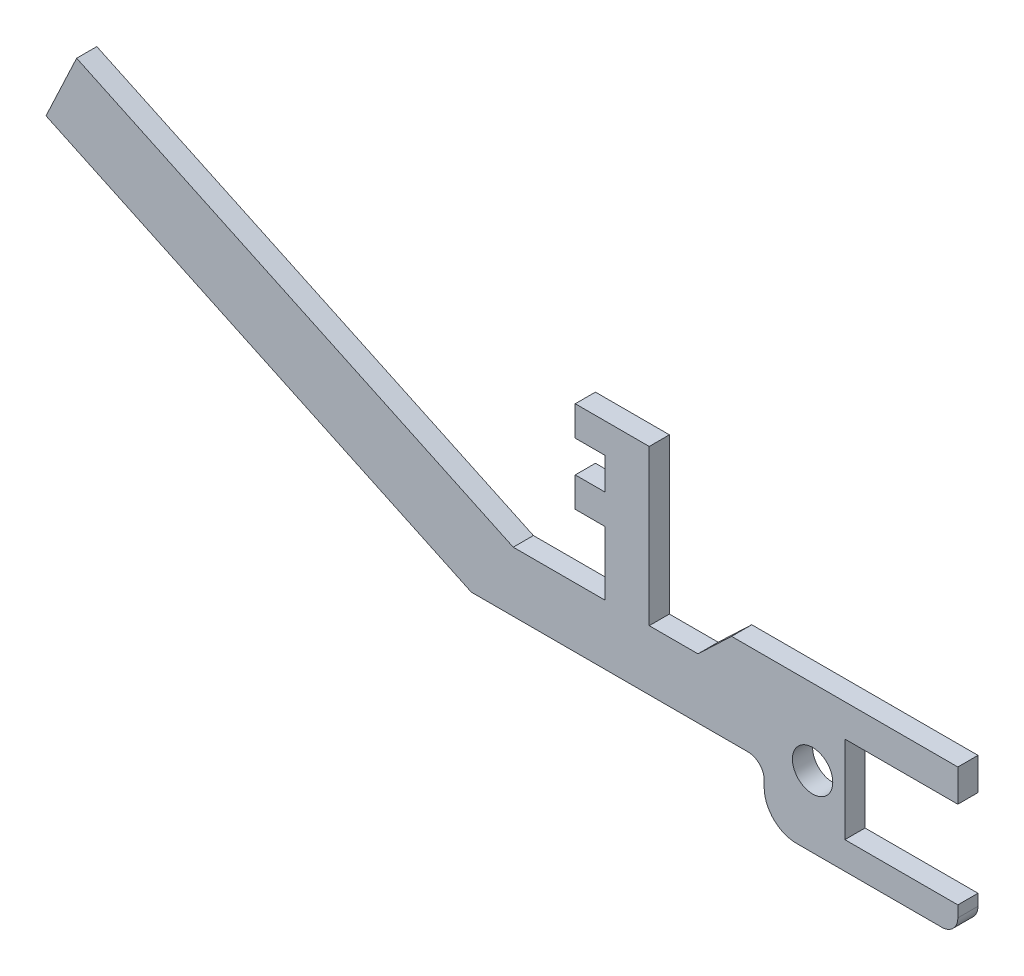
ISO-10303-21;
HEADER;
FILE_DESCRIPTION(('STEP AP214'),'2;1');
FILE_NAME('part.step','',(''),(''),'','','');
FILE_SCHEMA(('AUTOMOTIVE_DESIGN { 1 0 10303 214 1 1 1 1 }'));
ENDSEC;
DATA;
#1=APPLICATION_CONTEXT('core data for automotive mechanical design processes');
#2=APPLICATION_PROTOCOL_DEFINITION('international standard','automotive_design',2000,#1);
#3=PRODUCT_CONTEXT('',#1,'mechanical');
#4=PRODUCT('Part','Part','',(#3));
#5=PRODUCT_RELATED_PRODUCT_CATEGORY('part','',(#4));
#6=PRODUCT_DEFINITION_FORMATION('','',#4);
#7=PRODUCT_DEFINITION_CONTEXT('part definition',#1,'design');
#8=PRODUCT_DEFINITION('design','',#6,#7);
#9=PRODUCT_DEFINITION_SHAPE('','',#8);
#10=(LENGTH_UNIT() NAMED_UNIT(*) SI_UNIT(.MILLI.,.METRE.));
#11=(NAMED_UNIT(*) PLANE_ANGLE_UNIT() SI_UNIT($,.RADIAN.));
#12=(NAMED_UNIT(*) SI_UNIT($,.STERADIAN.) SOLID_ANGLE_UNIT());
#13=UNCERTAINTY_MEASURE_WITH_UNIT(LENGTH_MEASURE(1.E-05),#10,'distance_accuracy_value','');
#14=(GEOMETRIC_REPRESENTATION_CONTEXT(3) GLOBAL_UNCERTAINTY_ASSIGNED_CONTEXT((#13)) GLOBAL_UNIT_ASSIGNED_CONTEXT((#10,
#11,#12)) REPRESENTATION_CONTEXT('',''));
#15=CARTESIAN_POINT('',(0.,0.,0.));
#16=DIRECTION('',(0.,0.,1.));
#17=DIRECTION('',(1.,0.,0.));
#18=AXIS2_PLACEMENT_3D('',#15,#16,#17);
#19=CARTESIAN_POINT('',(-5.08,-2.52959583838729,1.5875));
#20=DIRECTION('',(0.,0.,-1.));
#21=DIRECTION('',(-1.,0.,0.));
#22=AXIS2_PLACEMENT_3D('',#19,#20,#21);
#23=PLANE('',#22);
#24=DIRECTION('',(-0.90506567515164,0.425271823264022,0.));
#25=VECTOR('',#24,1.);
#26=CARTESIAN_POINT('',(-23.5589132775391,3.45516403300759,1.5875));
#27=LINE('',#26,#25);
#28=CARTESIAN_POINT('',(-23.5589132775391,3.45516403300759,1.5875));
#29=VERTEX_POINT('',#28);
#30=CARTESIAN_POINT('',(-57.9194778554067,19.6004895575477,1.5875));
#31=VERTEX_POINT('',#30);
#32=EDGE_CURVE('E297',#29,#31,#27,.T.);
#33=ORIENTED_EDGE('',*,*,#32,.T.);
#34=DIRECTION('',(-0.425271823264022,-0.90506567515164,0.));
#35=VECTOR('',#34,1.);
#36=CARTESIAN_POINT('',(-60.3304128804337,14.4695252735159,1.5875));
#37=LINE('',#36,#35);
#38=CARTESIAN_POINT('',(-60.3304128804337,14.4695252735159,1.5875));
#39=VERTEX_POINT('',#38);
#40=EDGE_CURVE('E150',#31,#39,#37,.T.);
#41=ORIENTED_EDGE('',*,*,#40,.T.);
#42=DIRECTION('',(0.90506567515164,-0.425271823264022,0.));
#43=VECTOR('',#42,1.);
#44=CARTESIAN_POINT('',(-26.8556166679215,-1.2595958383873,1.5875));
#45=LINE('',#44,#43);
#46=CARTESIAN_POINT('',(-26.8556166679215,-1.2595958383873,1.5875));
#47=VERTEX_POINT('',#46);
#48=EDGE_CURVE('E369',#39,#47,#45,.T.);
#49=ORIENTED_EDGE('',*,*,#48,.T.);
#50=DIRECTION('',(1.,0.,0.));
#51=VECTOR('',#50,1.);
#52=CARTESIAN_POINT('',(-5.08000000000001,-1.25959583838729,1.5875));
#53=LINE('',#52,#51);
#54=CARTESIAN_POINT('',(-5.08000000000001,-1.25959583838729,1.5875));
#55=VERTEX_POINT('',#54);
#56=EDGE_CURVE('E388',#47,#55,#53,.T.);
#57=ORIENTED_EDGE('',*,*,#56,.T.);
#58=CARTESIAN_POINT('',(-5.08,-2.52959583838729,1.5875));
#59=DIRECTION('',(0.,0.,-1.));
#60=DIRECTION('',(-1.,0.,0.));
#61=AXIS2_PLACEMENT_3D('',#58,#59,#60);
#62=CIRCLE('',#61,1.27);
#63=CARTESIAN_POINT('',(-3.81,-2.5295958383873,1.5875));
#64=VERTEX_POINT('',#63);
#65=EDGE_CURVE('E385',#55,#64,#62,.T.);
#66=ORIENTED_EDGE('',*,*,#65,.T.);
#67=DIRECTION('',(0.,-1.,0.));
#68=VECTOR('',#67,1.);
#69=CARTESIAN_POINT('',(-3.81,-3.048,1.5875));
#70=LINE('',#69,#68);
#71=CARTESIAN_POINT('',(-3.81,-3.048,1.5875));
#72=VERTEX_POINT('',#71);
#73=EDGE_CURVE('E387',#64,#72,#70,.T.);
#74=ORIENTED_EDGE('',*,*,#73,.T.);
#75=CARTESIAN_POINT('',(-1.27,-3.048,1.5875));
#76=DIRECTION('',(0.,0.,1.));
#77=DIRECTION('',(-1.,0.,0.));
#78=AXIS2_PLACEMENT_3D('',#75,#76,#77);
#79=CIRCLE('',#78,2.54);
#80=CARTESIAN_POINT('',(-1.27,-5.588,1.5875));
#81=VERTEX_POINT('',#80);
#82=EDGE_CURVE('E390',#72,#81,#79,.T.);
#83=ORIENTED_EDGE('',*,*,#82,.T.);
#84=DIRECTION('',(1.,0.,0.));
#85=VECTOR('',#84,1.);
#86=CARTESIAN_POINT('',(10.16,-5.588,1.5875));
#87=LINE('',#86,#85);
#88=CARTESIAN_POINT('',(10.16,-5.588,1.5875));
#89=VERTEX_POINT('',#88);
#90=EDGE_CURVE('E396',#81,#89,#87,.T.);
#91=ORIENTED_EDGE('',*,*,#90,.T.);
#92=CARTESIAN_POINT('',(10.16,-4.318,1.5875));
#93=DIRECTION('',(0.,0.,1.));
#94=DIRECTION('',(-1.,0.,0.));
#95=AXIS2_PLACEMENT_3D('',#92,#93,#94);
#96=CIRCLE('',#95,1.27);
#97=CARTESIAN_POINT('',(11.43,-4.318,1.5875));
#98=VERTEX_POINT('',#97);
#99=EDGE_CURVE('E398',#89,#98,#96,.T.);
#100=ORIENTED_EDGE('',*,*,#99,.T.);
#101=DIRECTION('',(0.,1.,0.));
#102=VECTOR('',#101,1.);
#103=CARTESIAN_POINT('',(11.43,-3.429,1.5875));
#104=LINE('',#103,#102);
#105=CARTESIAN_POINT('',(11.43,-3.429,1.5875));
#106=VERTEX_POINT('',#105);
#107=EDGE_CURVE('E400',#98,#106,#104,.T.);
#108=ORIENTED_EDGE('',*,*,#107,.T.);
#109=DIRECTION('',(-1.,0.,0.));
#110=VECTOR('',#109,1.);
#111=CARTESIAN_POINT('',(2.54,-3.429,1.5875));
#112=LINE('',#111,#110);
#113=CARTESIAN_POINT('',(2.54,-3.429,1.5875));
#114=VERTEX_POINT('',#113);
#115=EDGE_CURVE('E402',#106,#114,#112,.T.);
#116=ORIENTED_EDGE('',*,*,#115,.T.);
#117=DIRECTION('',(0.,1.,0.));
#118=VECTOR('',#117,1.);
#119=CARTESIAN_POINT('',(2.54,3.429,1.5875));
#120=LINE('',#119,#118);
#121=CARTESIAN_POINT('',(2.54,3.429,1.5875));
#122=VERTEX_POINT('',#121);
#123=EDGE_CURVE('E404',#114,#122,#120,.T.);
#124=ORIENTED_EDGE('',*,*,#123,.T.);
#125=DIRECTION('',(1.,0.,0.));
#126=VECTOR('',#125,1.);
#127=CARTESIAN_POINT('',(11.43,3.429,1.5875));
#128=LINE('',#127,#126);
#129=CARTESIAN_POINT('',(11.43,3.429,1.5875));
#130=VERTEX_POINT('',#129);
#131=EDGE_CURVE('E406',#122,#130,#128,.T.);
#132=ORIENTED_EDGE('',*,*,#131,.T.);
#133=DIRECTION('',(0.,1.,0.));
#134=VECTOR('',#133,1.);
#135=CARTESIAN_POINT('',(11.43,5.969,1.5875));
#136=LINE('',#135,#134);
#137=CARTESIAN_POINT('',(11.43,5.969,1.5875));
#138=VERTEX_POINT('',#137);
#139=EDGE_CURVE('E408',#130,#138,#136,.T.);
#140=ORIENTED_EDGE('',*,*,#139,.T.);
#141=DIRECTION('',(-1.,0.,0.));
#142=VECTOR('',#141,1.);
#143=CARTESIAN_POINT('',(-6.3743216515683,5.969,1.5875));
#144=LINE('',#143,#142);
#145=CARTESIAN_POINT('',(-6.3743216515683,5.969,1.5875));
#146=VERTEX_POINT('',#145);
#147=EDGE_CURVE('E410',#138,#146,#144,.T.);
#148=ORIENTED_EDGE('',*,*,#147,.T.);
#149=DIRECTION('',(-0.724999433594413,-0.688749461914694,0.));
#150=VECTOR('',#149,1.);
#151=CARTESIAN_POINT('',(-9.0204647747182,3.45516403300759,1.5875));
#152=LINE('',#151,#150);
#153=CARTESIAN_POINT('',(-9.0204647747182,3.45516403300759,1.5875));
#154=VERTEX_POINT('',#153);
#155=EDGE_CURVE('E412',#146,#154,#152,.T.);
#156=ORIENTED_EDGE('',*,*,#155,.T.);
#157=DIRECTION('',(-1.,0.,0.));
#158=VECTOR('',#157,1.);
#159=CARTESIAN_POINT('',(-12.8573723032856,3.45516403300759,1.5875));
#160=LINE('',#159,#158);
#161=CARTESIAN_POINT('',(-12.8573723032856,3.45516403300759,1.5875));
#162=VERTEX_POINT('',#161);
#163=EDGE_CURVE('E414',#154,#162,#160,.T.);
#164=ORIENTED_EDGE('',*,*,#163,.T.);
#165=DIRECTION('',(0.,1.,0.));
#166=VECTOR('',#165,1.);
#167=CARTESIAN_POINT('',(-12.8573723032856,15.6723538511447,1.5875));
#168=LINE('',#167,#166);
#169=CARTESIAN_POINT('',(-12.8573723032856,15.6723538511447,1.5875));
#170=VERTEX_POINT('',#169);
#171=EDGE_CURVE('E416',#162,#170,#168,.T.);
#172=ORIENTED_EDGE('',*,*,#171,.T.);
#173=DIRECTION('',(-1.,0.,0.));
#174=VECTOR('',#173,1.);
#175=CARTESIAN_POINT('',(-18.6788871742153,15.6723538511447,1.5875));
#176=LINE('',#175,#174);
#177=CARTESIAN_POINT('',(-18.6788871742153,15.6723538511447,1.5875));
#178=VERTEX_POINT('',#177);
#179=EDGE_CURVE('E418',#170,#178,#176,.T.);
#180=ORIENTED_EDGE('',*,*,#179,.T.);
#181=DIRECTION('',(0.,-1.,0.));
#182=VECTOR('',#181,1.);
#183=CARTESIAN_POINT('',(-18.6788871742153,13.3247165239188,1.5875));
#184=LINE('',#183,#182);
#185=CARTESIAN_POINT('',(-18.6788871742153,13.3247165239188,1.5875));
#186=VERTEX_POINT('',#185);
#187=EDGE_CURVE('E420',#178,#186,#184,.T.);
#188=ORIENTED_EDGE('',*,*,#187,.T.);
#189=DIRECTION('',(1.,0.,0.));
#190=VECTOR('',#189,1.);
#191=CARTESIAN_POINT('',(-16.3258169562083,13.3247165239188,1.5875));
#192=LINE('',#191,#190);
#193=CARTESIAN_POINT('',(-16.3258169562083,13.3247165239188,1.5875));
#194=VERTEX_POINT('',#193);
#195=EDGE_CURVE('E422',#186,#194,#192,.T.);
#196=ORIENTED_EDGE('',*,*,#195,.T.);
#197=DIRECTION('',(0.,-1.,0.));
#198=VECTOR('',#197,1.);
#199=CARTESIAN_POINT('',(-16.3258169562083,10.8221766115146,1.5875));
#200=LINE('',#199,#198);
#201=CARTESIAN_POINT('',(-16.3258169562083,10.8221766115146,1.5875));
#202=VERTEX_POINT('',#201);
#203=EDGE_CURVE('E424',#194,#202,#200,.T.);
#204=ORIENTED_EDGE('',*,*,#203,.T.);
#205=DIRECTION('',(-1.,0.,0.));
#206=VECTOR('',#205,1.);
#207=CARTESIAN_POINT('',(-16.3258169562083,10.8221766115146,1.5875));
#208=LINE('',#207,#206);
#209=CARTESIAN_POINT('',(-18.6788871742153,10.8221766115146,1.5875));
#210=VERTEX_POINT('',#209);
#211=EDGE_CURVE('E426',#202,#210,#208,.T.);
#212=ORIENTED_EDGE('',*,*,#211,.T.);
#213=DIRECTION('',(0.,-1.,0.));
#214=VECTOR('',#213,1.);
#215=CARTESIAN_POINT('',(-18.6788871742153,10.8221766115146,1.5875));
#216=LINE('',#215,#214);
#217=CARTESIAN_POINT('',(-18.6788871742153,8.47453928428875,1.5875));
#218=VERTEX_POINT('',#217);
#219=EDGE_CURVE('E226',#210,#218,#216,.T.);
#220=ORIENTED_EDGE('',*,*,#219,.T.);
#221=DIRECTION('',(1.,0.,0.));
#222=VECTOR('',#221,1.);
#223=CARTESIAN_POINT('',(-18.6788871742153,8.47453928428875,1.5875));
#224=LINE('',#223,#222);
#225=CARTESIAN_POINT('',(-16.3258169562083,8.47453928428875,1.5875));
#226=VERTEX_POINT('',#225);
#227=EDGE_CURVE('E220',#218,#226,#224,.T.);
#228=ORIENTED_EDGE('',*,*,#227,.T.);
#229=DIRECTION('',(0.,-1.,0.));
#230=VECTOR('',#229,1.);
#231=CARTESIAN_POINT('',(-16.3258169562083,8.47453928428875,1.5875));
#232=LINE('',#231,#230);
#233=CARTESIAN_POINT('',(-16.3258169562083,3.45516403300759,1.5875));
#234=VERTEX_POINT('',#233);
#235=EDGE_CURVE('E224',#226,#234,#232,.T.);
#236=ORIENTED_EDGE('',*,*,#235,.T.);
#237=DIRECTION('',(-1.,0.,0.));
#238=VECTOR('',#237,1.);
#239=CARTESIAN_POINT('',(-16.3258169562083,3.45516403300759,1.5875));
#240=LINE('',#239,#238);
#241=EDGE_CURVE('E50',#234,#29,#240,.T.);
#242=ORIENTED_EDGE('',*,*,#241,.T.);
#243=EDGE_LOOP('',(#33,#41,#49,#57,#66,#74,#83,#91,#100,#108,#116,#124,#132,#140,#148,#156,#164,
#172,#180,#188,#196,#204,#212,#220,#228,#236,#242));
#244=FACE_BOUND('',#243,.T.);
#245=CARTESIAN_POINT('',(0.,0.,1.5875));
#246=DIRECTION('',(0.,0.,1.));
#247=DIRECTION('',(1.,0.,0.));
#248=AXIS2_PLACEMENT_3D('',#245,#246,#247);
#249=CIRCLE('',#248,1.5875);
#250=CARTESIAN_POINT('',(1.5875,0.,1.5875));
#251=VERTEX_POINT('',#250);
#252=EDGE_CURVE('E248',#251,#251,#249,.T.);
#253=ORIENTED_EDGE('',*,*,#252,.F.);
#254=EDGE_LOOP('',(#253));
#255=FACE_BOUND('',#254,.T.);
#256=ADVANCED_FACE('F33',(#244,#255),#23,.F.);
#257=CARTESIAN_POINT('',(-5.08,-2.52959583838729,0.));
#258=DIRECTION('',(0.,0.,-1.));
#259=DIRECTION('',(-1.,0.,0.));
#260=AXIS2_PLACEMENT_3D('',#257,#258,#259);
#261=PLANE('',#260);
#262=DIRECTION('',(-0.90506567515164,0.425271823264022,0.));
#263=VECTOR('',#262,1.);
#264=CARTESIAN_POINT('',(-23.5589132775391,3.45516403300759,0.));
#265=LINE('',#264,#263);
#266=CARTESIAN_POINT('',(-23.5589132775391,3.45516403300759,0.));
#267=VERTEX_POINT('',#266);
#268=CARTESIAN_POINT('',(-57.9194778554067,19.6004895575477,0.));
#269=VERTEX_POINT('',#268);
#270=EDGE_CURVE('E244',#267,#269,#265,.T.);
#271=ORIENTED_EDGE('',*,*,#270,.F.);
#272=DIRECTION('',(-1.,0.,0.));
#273=VECTOR('',#272,1.);
#274=CARTESIAN_POINT('',(-16.3258169562083,3.45516403300759,0.));
#275=LINE('',#274,#273);
#276=CARTESIAN_POINT('',(-16.3258169562083,3.45516403300759,0.));
#277=VERTEX_POINT('',#276);
#278=EDGE_CURVE('E142',#277,#267,#275,.T.);
#279=ORIENTED_EDGE('',*,*,#278,.F.);
#280=DIRECTION('',(0.,-1.,0.));
#281=VECTOR('',#280,1.);
#282=CARTESIAN_POINT('',(-16.3258169562083,8.47453928428875,0.));
#283=LINE('',#282,#281);
#284=CARTESIAN_POINT('',(-16.3258169562083,8.47453928428875,0.));
#285=VERTEX_POINT('',#284);
#286=EDGE_CURVE('E136',#285,#277,#283,.T.);
#287=ORIENTED_EDGE('',*,*,#286,.F.);
#288=DIRECTION('',(1.,0.,0.));
#289=VECTOR('',#288,1.);
#290=CARTESIAN_POINT('',(-18.6788871742153,8.47453928428875,0.));
#291=LINE('',#290,#289);
#292=CARTESIAN_POINT('',(-18.6788871742153,8.47453928428875,0.));
#293=VERTEX_POINT('',#292);
#294=EDGE_CURVE('E234',#293,#285,#291,.T.);
#295=ORIENTED_EDGE('',*,*,#294,.F.);
#296=DIRECTION('',(0.,-1.,0.));
#297=VECTOR('',#296,1.);
#298=CARTESIAN_POINT('',(-18.6788871742153,10.8221766115146,0.));
#299=LINE('',#298,#297);
#300=CARTESIAN_POINT('',(-18.6788871742153,10.8221766115146,0.));
#301=VERTEX_POINT('',#300);
#302=EDGE_CURVE('E292',#301,#293,#299,.T.);
#303=ORIENTED_EDGE('',*,*,#302,.F.);
#304=DIRECTION('',(-1.,0.,0.));
#305=VECTOR('',#304,1.);
#306=CARTESIAN_POINT('',(-16.3258169562083,10.8221766115146,0.));
#307=LINE('',#306,#305);
#308=CARTESIAN_POINT('',(-16.3258169562083,10.8221766115146,0.));
#309=VERTEX_POINT('',#308);
#310=EDGE_CURVE('E290',#309,#301,#307,.T.);
#311=ORIENTED_EDGE('',*,*,#310,.F.);
#312=DIRECTION('',(0.,-1.,0.));
#313=VECTOR('',#312,1.);
#314=CARTESIAN_POINT('',(-16.3258169562083,10.8221766115146,0.));
#315=LINE('',#314,#313);
#316=CARTESIAN_POINT('',(-16.3258169562083,13.3247165239188,0.));
#317=VERTEX_POINT('',#316);
#318=EDGE_CURVE('E288',#317,#309,#315,.T.);
#319=ORIENTED_EDGE('',*,*,#318,.F.);
#320=DIRECTION('',(1.,0.,0.));
#321=VECTOR('',#320,1.);
#322=CARTESIAN_POINT('',(-16.3258169562083,13.3247165239188,0.));
#323=LINE('',#322,#321);
#324=CARTESIAN_POINT('',(-18.6788871742153,13.3247165239188,0.));
#325=VERTEX_POINT('',#324);
#326=EDGE_CURVE('E286',#325,#317,#323,.T.);
#327=ORIENTED_EDGE('',*,*,#326,.F.);
#328=DIRECTION('',(0.,-1.,0.));
#329=VECTOR('',#328,1.);
#330=CARTESIAN_POINT('',(-18.6788871742153,13.3247165239188,0.));
#331=LINE('',#330,#329);
#332=CARTESIAN_POINT('',(-18.6788871742153,15.6723538511447,0.));
#333=VERTEX_POINT('',#332);
#334=EDGE_CURVE('E284',#333,#325,#331,.T.);
#335=ORIENTED_EDGE('',*,*,#334,.F.);
#336=DIRECTION('',(-1.,0.,0.));
#337=VECTOR('',#336,1.);
#338=CARTESIAN_POINT('',(-18.6788871742153,15.6723538511447,0.));
#339=LINE('',#338,#337);
#340=CARTESIAN_POINT('',(-12.8573723032856,15.6723538511447,0.));
#341=VERTEX_POINT('',#340);
#342=EDGE_CURVE('E282',#341,#333,#339,.T.);
#343=ORIENTED_EDGE('',*,*,#342,.F.);
#344=DIRECTION('',(0.,1.,0.));
#345=VECTOR('',#344,1.);
#346=CARTESIAN_POINT('',(-12.8573723032856,15.6723538511447,0.));
#347=LINE('',#346,#345);
#348=CARTESIAN_POINT('',(-12.8573723032856,3.45516403300759,0.));
#349=VERTEX_POINT('',#348);
#350=EDGE_CURVE('E280',#349,#341,#347,.T.);
#351=ORIENTED_EDGE('',*,*,#350,.F.);
#352=DIRECTION('',(-1.,0.,0.));
#353=VECTOR('',#352,1.);
#354=CARTESIAN_POINT('',(-12.8573723032856,3.45516403300759,0.));
#355=LINE('',#354,#353);
#356=CARTESIAN_POINT('',(-9.0204647747182,3.45516403300759,0.));
#357=VERTEX_POINT('',#356);
#358=EDGE_CURVE('E278',#357,#349,#355,.T.);
#359=ORIENTED_EDGE('',*,*,#358,.F.);
#360=DIRECTION('',(-0.724999433594413,-0.688749461914694,0.));
#361=VECTOR('',#360,1.);
#362=CARTESIAN_POINT('',(-9.0204647747182,3.45516403300759,0.));
#363=LINE('',#362,#361);
#364=CARTESIAN_POINT('',(-6.3743216515683,5.969,0.));
#365=VERTEX_POINT('',#364);
#366=EDGE_CURVE('E276',#365,#357,#363,.T.);
#367=ORIENTED_EDGE('',*,*,#366,.F.);
#368=DIRECTION('',(-1.,0.,0.));
#369=VECTOR('',#368,1.);
#370=CARTESIAN_POINT('',(-6.3743216515683,5.969,0.));
#371=LINE('',#370,#369);
#372=CARTESIAN_POINT('',(11.43,5.969,0.));
#373=VERTEX_POINT('',#372);
#374=EDGE_CURVE('E274',#373,#365,#371,.T.);
#375=ORIENTED_EDGE('',*,*,#374,.F.);
#376=DIRECTION('',(0.,1.,0.));
#377=VECTOR('',#376,1.);
#378=CARTESIAN_POINT('',(11.43,5.969,0.));
#379=LINE('',#378,#377);
#380=CARTESIAN_POINT('',(11.43,3.429,0.));
#381=VERTEX_POINT('',#380);
#382=EDGE_CURVE('E272',#381,#373,#379,.T.);
#383=ORIENTED_EDGE('',*,*,#382,.F.);
#384=DIRECTION('',(1.,0.,0.));
#385=VECTOR('',#384,1.);
#386=CARTESIAN_POINT('',(11.43,3.429,0.));
#387=LINE('',#386,#385);
#388=CARTESIAN_POINT('',(2.54,3.429,0.));
#389=VERTEX_POINT('',#388);
#390=EDGE_CURVE('E270',#389,#381,#387,.T.);
#391=ORIENTED_EDGE('',*,*,#390,.F.);
#392=DIRECTION('',(0.,1.,0.));
#393=VECTOR('',#392,1.);
#394=CARTESIAN_POINT('',(2.54,3.429,0.));
#395=LINE('',#394,#393);
#396=CARTESIAN_POINT('',(2.54,-3.429,0.));
#397=VERTEX_POINT('',#396);
#398=EDGE_CURVE('E268',#397,#389,#395,.T.);
#399=ORIENTED_EDGE('',*,*,#398,.F.);
#400=DIRECTION('',(-1.,0.,0.));
#401=VECTOR('',#400,1.);
#402=CARTESIAN_POINT('',(2.54,-3.429,0.));
#403=LINE('',#402,#401);
#404=CARTESIAN_POINT('',(11.43,-3.429,0.));
#405=VERTEX_POINT('',#404);
#406=EDGE_CURVE('E266',#405,#397,#403,.T.);
#407=ORIENTED_EDGE('',*,*,#406,.F.);
#408=DIRECTION('',(0.,1.,0.));
#409=VECTOR('',#408,1.);
#410=CARTESIAN_POINT('',(11.43,-3.429,0.));
#411=LINE('',#410,#409);
#412=CARTESIAN_POINT('',(11.43,-4.318,0.));
#413=VERTEX_POINT('',#412);
#414=EDGE_CURVE('E264',#413,#405,#411,.T.);
#415=ORIENTED_EDGE('',*,*,#414,.F.);
#416=CARTESIAN_POINT('',(10.16,-4.318,0.));
#417=DIRECTION('',(0.,0.,1.));
#418=DIRECTION('',(-1.,0.,0.));
#419=AXIS2_PLACEMENT_3D('',#416,#417,#418);
#420=CIRCLE('',#419,1.27);
#421=CARTESIAN_POINT('',(10.16,-5.588,0.));
#422=VERTEX_POINT('',#421);
#423=EDGE_CURVE('E262',#422,#413,#420,.T.);
#424=ORIENTED_EDGE('',*,*,#423,.F.);
#425=DIRECTION('',(1.,0.,0.));
#426=VECTOR('',#425,1.);
#427=CARTESIAN_POINT('',(10.16,-5.588,0.));
#428=LINE('',#427,#426);
#429=CARTESIAN_POINT('',(-1.27,-5.588,0.));
#430=VERTEX_POINT('',#429);
#431=EDGE_CURVE('E260',#430,#422,#428,.T.);
#432=ORIENTED_EDGE('',*,*,#431,.F.);
#433=CARTESIAN_POINT('',(-1.27,-3.048,0.));
#434=DIRECTION('',(0.,0.,1.));
#435=DIRECTION('',(-1.,0.,0.));
#436=AXIS2_PLACEMENT_3D('',#433,#434,#435);
#437=CIRCLE('',#436,2.54);
#438=CARTESIAN_POINT('',(-3.81,-3.048,0.));
#439=VERTEX_POINT('',#438);
#440=EDGE_CURVE('E258',#439,#430,#437,.T.);
#441=ORIENTED_EDGE('',*,*,#440,.F.);
#442=DIRECTION('',(0.,-1.,0.));
#443=VECTOR('',#442,1.);
#444=CARTESIAN_POINT('',(-3.81,-3.048,0.));
#445=LINE('',#444,#443);
#446=CARTESIAN_POINT('',(-3.81,-2.5295958383873,0.));
#447=VERTEX_POINT('',#446);
#448=EDGE_CURVE('E256',#447,#439,#445,.T.);
#449=ORIENTED_EDGE('',*,*,#448,.F.);
#450=CARTESIAN_POINT('',(-5.08,-2.52959583838729,0.));
#451=DIRECTION('',(0.,0.,-1.));
#452=DIRECTION('',(-1.,0.,0.));
#453=AXIS2_PLACEMENT_3D('',#450,#451,#452);
#454=CIRCLE('',#453,1.27);
#455=CARTESIAN_POINT('',(-5.08000000000001,-1.25959583838729,0.));
#456=VERTEX_POINT('',#455);
#457=EDGE_CURVE('E254',#456,#447,#454,.T.);
#458=ORIENTED_EDGE('',*,*,#457,.F.);
#459=DIRECTION('',(1.,0.,0.));
#460=VECTOR('',#459,1.);
#461=CARTESIAN_POINT('',(-5.08000000000001,-1.25959583838729,0.));
#462=LINE('',#461,#460);
#463=CARTESIAN_POINT('',(-26.8556166679215,-1.2595958383873,0.));
#464=VERTEX_POINT('',#463);
#465=EDGE_CURVE('E252',#464,#456,#462,.T.);
#466=ORIENTED_EDGE('',*,*,#465,.F.);
#467=DIRECTION('',(0.90506567515164,-0.425271823264022,0.));
#468=VECTOR('',#467,1.);
#469=CARTESIAN_POINT('',(-26.8556166679215,-1.2595958383873,0.));
#470=LINE('',#469,#468);
#471=CARTESIAN_POINT('',(-60.3304128804337,14.4695252735159,0.));
#472=VERTEX_POINT('',#471);
#473=EDGE_CURVE('E250',#472,#464,#470,.T.);
#474=ORIENTED_EDGE('',*,*,#473,.F.);
#475=DIRECTION('',(-0.425271823264022,-0.90506567515164,0.));
#476=VECTOR('',#475,1.);
#477=CARTESIAN_POINT('',(-60.3304128804337,14.4695252735159,0.));
#478=LINE('',#477,#476);
#479=EDGE_CURVE('E247',#269,#472,#478,.T.);
#480=ORIENTED_EDGE('',*,*,#479,.F.);
#481=EDGE_LOOP('',(#271,#279,#287,#295,#303,#311,#319,#327,#335,#343,#351,#359,#367,#375,#383,
#391,#399,#407,#415,#424,#432,#441,#449,#458,#466,#474,#480));
#482=FACE_BOUND('',#481,.T.);
#483=CARTESIAN_POINT('',(0.,0.,0.));
#484=DIRECTION('',(0.,0.,1.));
#485=DIRECTION('',(1.,0.,0.));
#486=AXIS2_PLACEMENT_3D('',#483,#484,#485);
#487=CIRCLE('',#486,1.5875);
#488=CARTESIAN_POINT('',(1.5875,0.,0.));
#489=VERTEX_POINT('',#488);
#490=EDGE_CURVE('E768',#489,#489,#487,.T.);
#491=ORIENTED_EDGE('',*,*,#490,.T.);
#492=EDGE_LOOP('',(#491));
#493=FACE_BOUND('',#492,.T.);
#494=ADVANCED_FACE('F373',(#482,#493),#261,.T.);
#495=CARTESIAN_POINT('',(-23.5589132775391,3.45516403300759,1.5875));
#496=DIRECTION('',(-0.425271823264022,-0.90506567515164,0.));
#497=DIRECTION('',(0.90506567515164,-0.425271823264022,0.));
#498=AXIS2_PLACEMENT_3D('',#495,#496,#497);
#499=PLANE('',#498);
#500=ORIENTED_EDGE('',*,*,#270,.T.);
#501=DIRECTION('',(0.,0.,-1.));
#502=VECTOR('',#501,1.);
#503=CARTESIAN_POINT('',(-57.9194778554067,19.6004895575477,1.5875));
#504=LINE('',#503,#502);
#505=EDGE_CURVE('E11',#31,#269,#504,.T.);
#506=ORIENTED_EDGE('',*,*,#505,.F.);
#507=ORIENTED_EDGE('',*,*,#32,.F.);
#508=DIRECTION('',(0.,0.,-1.));
#509=VECTOR('',#508,1.);
#510=CARTESIAN_POINT('',(-23.5589132775391,3.45516403300759,1.5875));
#511=LINE('',#510,#509);
#512=EDGE_CURVE('E240',#29,#267,#511,.T.);
#513=ORIENTED_EDGE('',*,*,#512,.T.);
#514=EDGE_LOOP('',(#500,#506,#507,#513));
#515=FACE_BOUND('',#514,.T.);
#516=ADVANCED_FACE('F35',(#515),#499,.F.);
#517=CARTESIAN_POINT('',(-60.3304128804337,14.4695252735159,1.5875));
#518=DIRECTION('',(0.90506567515164,-0.425271823264022,0.));
#519=DIRECTION('',(0.425271823264022,0.90506567515164,0.));
#520=AXIS2_PLACEMENT_3D('',#517,#518,#519);
#521=PLANE('',#520);
#522=ORIENTED_EDGE('',*,*,#479,.T.);
#523=DIRECTION('',(0.,0.,-1.));
#524=VECTOR('',#523,1.);
#525=CARTESIAN_POINT('',(-60.3304128804337,14.4695252735159,1.5875));
#526=LINE('',#525,#524);
#527=EDGE_CURVE('E42',#39,#472,#526,.T.);
#528=ORIENTED_EDGE('',*,*,#527,.F.);
#529=ORIENTED_EDGE('',*,*,#40,.F.);
#530=ORIENTED_EDGE('',*,*,#505,.T.);
#531=EDGE_LOOP('',(#522,#528,#529,#530));
#532=FACE_BOUND('',#531,.T.);
#533=ADVANCED_FACE('F460',(#532),#521,.F.);
#534=CARTESIAN_POINT('',(-26.8556166679215,-1.2595958383873,1.5875));
#535=DIRECTION('',(0.425271823264022,0.90506567515164,0.));
#536=DIRECTION('',(-0.90506567515164,0.425271823264022,0.));
#537=AXIS2_PLACEMENT_3D('',#534,#535,#536);
#538=PLANE('',#537);
#539=ORIENTED_EDGE('',*,*,#473,.T.);
#540=DIRECTION('',(0.,0.,-1.));
#541=VECTOR('',#540,1.);
#542=CARTESIAN_POINT('',(-26.8556166679215,-1.2595958383873,1.5875));
#543=LINE('',#542,#541);
#544=EDGE_CURVE('E361',#47,#464,#543,.T.);
#545=ORIENTED_EDGE('',*,*,#544,.F.);
#546=ORIENTED_EDGE('',*,*,#48,.F.);
#547=ORIENTED_EDGE('',*,*,#527,.T.);
#548=EDGE_LOOP('',(#539,#545,#546,#547));
#549=FACE_BOUND('',#548,.T.);
#550=ADVANCED_FACE('F367',(#549),#538,.F.);
#551=CARTESIAN_POINT('',(-5.08000000000001,-1.25959583838729,1.5875));
#552=DIRECTION('',(0.,1.,0.));
#553=DIRECTION('',(-1.,0.,0.));
#554=AXIS2_PLACEMENT_3D('',#551,#552,#553);
#555=PLANE('',#554);
#556=ORIENTED_EDGE('',*,*,#465,.T.);
#557=DIRECTION('',(0.,0.,-1.));
#558=VECTOR('',#557,1.);
#559=CARTESIAN_POINT('',(-5.08000000000001,-1.25959583838729,1.5875));
#560=LINE('',#559,#558);
#561=EDGE_CURVE('E358',#55,#456,#560,.T.);
#562=ORIENTED_EDGE('',*,*,#561,.F.);
#563=ORIENTED_EDGE('',*,*,#56,.F.);
#564=ORIENTED_EDGE('',*,*,#544,.T.);
#565=EDGE_LOOP('',(#556,#562,#563,#564));
#566=FACE_BOUND('',#565,.T.);
#567=ADVANCED_FACE('F379',(#566),#555,.F.);
#568=CARTESIAN_POINT('',(-5.08,-2.52959583838729,1.5875));
#569=DIRECTION('',(0.,0.,-1.));
#570=DIRECTION('',(-1.,0.,0.));
#571=AXIS2_PLACEMENT_3D('',#568,#569,#570);
#572=CYLINDRICAL_SURFACE('',#571,1.27);
#573=ORIENTED_EDGE('',*,*,#457,.T.);
#574=DIRECTION('',(0.,0.,-1.));
#575=VECTOR('',#574,1.);
#576=CARTESIAN_POINT('',(-3.81,-2.5295958383873,1.5875));
#577=LINE('',#576,#575);
#578=EDGE_CURVE('E355',#64,#447,#577,.T.);
#579=ORIENTED_EDGE('',*,*,#578,.F.);
#580=ORIENTED_EDGE('',*,*,#65,.F.);
#581=ORIENTED_EDGE('',*,*,#561,.T.);
#582=EDGE_LOOP('',(#573,#579,#580,#581));
#583=FACE_BOUND('',#582,.T.);
#584=ADVANCED_FACE('F383',(#583),#572,.F.);
#585=CARTESIAN_POINT('',(-3.81,-3.048,1.5875));
#586=DIRECTION('',(1.,0.,0.));
#587=DIRECTION('',(0.,0.,-1.));
#588=AXIS2_PLACEMENT_3D('',#585,#586,#587);
#589=PLANE('',#588);
#590=ORIENTED_EDGE('',*,*,#448,.T.);
#591=DIRECTION('',(0.,0.,-1.));
#592=VECTOR('',#591,1.);
#593=CARTESIAN_POINT('',(-3.81,-3.048,1.5875));
#594=LINE('',#593,#592);
#595=EDGE_CURVE('E352',#72,#439,#594,.T.);
#596=ORIENTED_EDGE('',*,*,#595,.F.);
#597=ORIENTED_EDGE('',*,*,#73,.F.);
#598=ORIENTED_EDGE('',*,*,#578,.T.);
#599=EDGE_LOOP('',(#590,#596,#597,#598));
#600=FACE_BOUND('',#599,.T.);
#601=ADVANCED_FACE('F473',(#600),#589,.F.);
#602=CARTESIAN_POINT('',(-1.27,-3.048,1.5875));
#603=DIRECTION('',(0.,0.,-1.));
#604=DIRECTION('',(-1.,0.,0.));
#605=AXIS2_PLACEMENT_3D('',#602,#603,#604);
#606=CYLINDRICAL_SURFACE('',#605,2.54);
#607=ORIENTED_EDGE('',*,*,#440,.T.);
#608=DIRECTION('',(0.,0.,-1.));
#609=VECTOR('',#608,1.);
#610=CARTESIAN_POINT('',(-1.27,-5.588,1.5875));
#611=LINE('',#610,#609);
#612=EDGE_CURVE('E349',#81,#430,#611,.T.);
#613=ORIENTED_EDGE('',*,*,#612,.F.);
#614=ORIENTED_EDGE('',*,*,#82,.F.);
#615=ORIENTED_EDGE('',*,*,#595,.T.);
#616=EDGE_LOOP('',(#607,#613,#614,#615));
#617=FACE_BOUND('',#616,.T.);
#618=ADVANCED_FACE('F476',(#617),#606,.T.);
#619=CARTESIAN_POINT('',(10.16,-5.588,1.5875));
#620=DIRECTION('',(0.,1.,0.));
#621=DIRECTION('',(0.,0.,1.));
#622=AXIS2_PLACEMENT_3D('',#619,#620,#621);
#623=PLANE('',#622);
#624=ORIENTED_EDGE('',*,*,#431,.T.);
#625=DIRECTION('',(0.,0.,-1.));
#626=VECTOR('',#625,1.);
#627=CARTESIAN_POINT('',(10.16,-5.588,1.5875));
#628=LINE('',#627,#626);
#629=EDGE_CURVE('E346',#89,#422,#628,.T.);
#630=ORIENTED_EDGE('',*,*,#629,.F.);
#631=ORIENTED_EDGE('',*,*,#90,.F.);
#632=ORIENTED_EDGE('',*,*,#612,.T.);
#633=EDGE_LOOP('',(#624,#630,#631,#632));
#634=FACE_BOUND('',#633,.T.);
#635=ADVANCED_FACE('F480',(#634),#623,.F.);
#636=CARTESIAN_POINT('',(10.16,-4.318,1.5875));
#637=DIRECTION('',(0.,0.,-1.));
#638=DIRECTION('',(-1.,0.,0.));
#639=AXIS2_PLACEMENT_3D('',#636,#637,#638);
#640=CYLINDRICAL_SURFACE('',#639,1.27);
#641=ORIENTED_EDGE('',*,*,#423,.T.);
#642=DIRECTION('',(0.,0.,-1.));
#643=VECTOR('',#642,1.);
#644=CARTESIAN_POINT('',(11.43,-4.318,1.5875));
#645=LINE('',#644,#643);
#646=EDGE_CURVE('E343',#98,#413,#645,.T.);
#647=ORIENTED_EDGE('',*,*,#646,.F.);
#648=ORIENTED_EDGE('',*,*,#99,.F.);
#649=ORIENTED_EDGE('',*,*,#629,.T.);
#650=EDGE_LOOP('',(#641,#647,#648,#649));
#651=FACE_BOUND('',#650,.T.);
#652=ADVANCED_FACE('F484',(#651),#640,.T.);
#653=CARTESIAN_POINT('',(11.43,-3.429,1.5875));
#654=DIRECTION('',(-1.,0.,0.));
#655=DIRECTION('',(0.,0.,1.));
#656=AXIS2_PLACEMENT_3D('',#653,#654,#655);
#657=PLANE('',#656);
#658=ORIENTED_EDGE('',*,*,#414,.T.);
#659=DIRECTION('',(0.,0.,-1.));
#660=VECTOR('',#659,1.);
#661=CARTESIAN_POINT('',(11.43,-3.429,1.5875));
#662=LINE('',#661,#660);
#663=EDGE_CURVE('E340',#106,#405,#662,.T.);
#664=ORIENTED_EDGE('',*,*,#663,.F.);
#665=ORIENTED_EDGE('',*,*,#107,.F.);
#666=ORIENTED_EDGE('',*,*,#646,.T.);
#667=EDGE_LOOP('',(#658,#664,#665,#666));
#668=FACE_BOUND('',#667,.T.);
#669=ADVANCED_FACE('F488',(#668),#657,.F.);
#670=CARTESIAN_POINT('',(2.54,-3.429,1.5875));
#671=DIRECTION('',(0.,-1.,0.));
#672=DIRECTION('',(1.,0.,0.));
#673=AXIS2_PLACEMENT_3D('',#670,#671,#672);
#674=PLANE('',#673);
#675=ORIENTED_EDGE('',*,*,#406,.T.);
#676=DIRECTION('',(0.,0.,-1.));
#677=VECTOR('',#676,1.);
#678=CARTESIAN_POINT('',(2.54,-3.429,1.5875));
#679=LINE('',#678,#677);
#680=EDGE_CURVE('E337',#114,#397,#679,.T.);
#681=ORIENTED_EDGE('',*,*,#680,.F.);
#682=ORIENTED_EDGE('',*,*,#115,.F.);
#683=ORIENTED_EDGE('',*,*,#663,.T.);
#684=EDGE_LOOP('',(#675,#681,#682,#683));
#685=FACE_BOUND('',#684,.T.);
#686=ADVANCED_FACE('F492',(#685),#674,.F.);
#687=CARTESIAN_POINT('',(2.54,3.429,1.5875));
#688=DIRECTION('',(-1.,0.,0.));
#689=DIRECTION('',(0.,0.,1.));
#690=AXIS2_PLACEMENT_3D('',#687,#688,#689);
#691=PLANE('',#690);
#692=ORIENTED_EDGE('',*,*,#398,.T.);
#693=DIRECTION('',(0.,0.,-1.));
#694=VECTOR('',#693,1.);
#695=CARTESIAN_POINT('',(2.54,3.429,1.5875));
#696=LINE('',#695,#694);
#697=EDGE_CURVE('E334',#122,#389,#696,.T.);
#698=ORIENTED_EDGE('',*,*,#697,.F.);
#699=ORIENTED_EDGE('',*,*,#123,.F.);
#700=ORIENTED_EDGE('',*,*,#680,.T.);
#701=EDGE_LOOP('',(#692,#698,#699,#700));
#702=FACE_BOUND('',#701,.T.);
#703=ADVANCED_FACE('F496',(#702),#691,.F.);
#704=CARTESIAN_POINT('',(11.43,3.429,1.5875));
#705=DIRECTION('',(0.,1.,0.));
#706=DIRECTION('',(-1.,0.,0.));
#707=AXIS2_PLACEMENT_3D('',#704,#705,#706);
#708=PLANE('',#707);
#709=ORIENTED_EDGE('',*,*,#390,.T.);
#710=DIRECTION('',(0.,0.,-1.));
#711=VECTOR('',#710,1.);
#712=CARTESIAN_POINT('',(11.43,3.429,1.5875));
#713=LINE('',#712,#711);
#714=EDGE_CURVE('E331',#130,#381,#713,.T.);
#715=ORIENTED_EDGE('',*,*,#714,.F.);
#716=ORIENTED_EDGE('',*,*,#131,.F.);
#717=ORIENTED_EDGE('',*,*,#697,.T.);
#718=EDGE_LOOP('',(#709,#715,#716,#717));
#719=FACE_BOUND('',#718,.T.);
#720=ADVANCED_FACE('F500',(#719),#708,.F.);
#721=CARTESIAN_POINT('',(11.43,5.969,1.5875));
#722=DIRECTION('',(-1.,0.,0.));
#723=DIRECTION('',(0.,-1.,0.));
#724=AXIS2_PLACEMENT_3D('',#721,#722,#723);
#725=PLANE('',#724);
#726=ORIENTED_EDGE('',*,*,#382,.T.);
#727=DIRECTION('',(0.,0.,-1.));
#728=VECTOR('',#727,1.);
#729=CARTESIAN_POINT('',(11.43,5.969,1.5875));
#730=LINE('',#729,#728);
#731=EDGE_CURVE('E328',#138,#373,#730,.T.);
#732=ORIENTED_EDGE('',*,*,#731,.F.);
#733=ORIENTED_EDGE('',*,*,#139,.F.);
#734=ORIENTED_EDGE('',*,*,#714,.T.);
#735=EDGE_LOOP('',(#726,#732,#733,#734));
#736=FACE_BOUND('',#735,.T.);
#737=ADVANCED_FACE('F504',(#736),#725,.F.);
#738=CARTESIAN_POINT('',(-6.3743216515683,5.969,1.5875));
#739=DIRECTION('',(0.,-1.,0.));
#740=DIRECTION('',(0.,0.,-1.));
#741=AXIS2_PLACEMENT_3D('',#738,#739,#740);
#742=PLANE('',#741);
#743=ORIENTED_EDGE('',*,*,#374,.T.);
#744=DIRECTION('',(0.,0.,-1.));
#745=VECTOR('',#744,1.);
#746=CARTESIAN_POINT('',(-6.3743216515683,5.969,1.5875));
#747=LINE('',#746,#745);
#748=EDGE_CURVE('E325',#146,#365,#747,.T.);
#749=ORIENTED_EDGE('',*,*,#748,.F.);
#750=ORIENTED_EDGE('',*,*,#147,.F.);
#751=ORIENTED_EDGE('',*,*,#731,.T.);
#752=EDGE_LOOP('',(#743,#749,#750,#751));
#753=FACE_BOUND('',#752,.T.);
#754=ADVANCED_FACE('F508',(#753),#742,.F.);
#755=CARTESIAN_POINT('',(-9.0204647747182,3.45516403300759,1.5875));
#756=DIRECTION('',(0.688749461914694,-0.724999433594413,0.));
#757=DIRECTION('',(0.724999433594413,0.688749461914694,0.));
#758=AXIS2_PLACEMENT_3D('',#755,#756,#757);
#759=PLANE('',#758);
#760=ORIENTED_EDGE('',*,*,#366,.T.);
#761=DIRECTION('',(0.,0.,-1.));
#762=VECTOR('',#761,1.);
#763=CARTESIAN_POINT('',(-9.0204647747182,3.45516403300759,1.5875));
#764=LINE('',#763,#762);
#765=EDGE_CURVE('E322',#154,#357,#764,.T.);
#766=ORIENTED_EDGE('',*,*,#765,.F.);
#767=ORIENTED_EDGE('',*,*,#155,.F.);
#768=ORIENTED_EDGE('',*,*,#748,.T.);
#769=EDGE_LOOP('',(#760,#766,#767,#768));
#770=FACE_BOUND('',#769,.T.);
#771=ADVANCED_FACE('F512',(#770),#759,.F.);
#772=CARTESIAN_POINT('',(-12.8573723032856,3.45516403300759,1.5875));
#773=DIRECTION('',(0.,-1.,0.));
#774=DIRECTION('',(0.,0.,-1.));
#775=AXIS2_PLACEMENT_3D('',#772,#773,#774);
#776=PLANE('',#775);
#777=ORIENTED_EDGE('',*,*,#358,.T.);
#778=DIRECTION('',(0.,0.,-1.));
#779=VECTOR('',#778,1.);
#780=CARTESIAN_POINT('',(-12.8573723032856,3.45516403300759,1.5875));
#781=LINE('',#780,#779);
#782=EDGE_CURVE('E319',#162,#349,#781,.T.);
#783=ORIENTED_EDGE('',*,*,#782,.F.);
#784=ORIENTED_EDGE('',*,*,#163,.F.);
#785=ORIENTED_EDGE('',*,*,#765,.T.);
#786=EDGE_LOOP('',(#777,#783,#784,#785));
#787=FACE_BOUND('',#786,.T.);
#788=ADVANCED_FACE('F516',(#787),#776,.F.);
#789=CARTESIAN_POINT('',(-12.8573723032856,15.6723538511447,1.5875));
#790=DIRECTION('',(-1.,0.,0.));
#791=DIRECTION('',(0.,-1.,0.));
#792=AXIS2_PLACEMENT_3D('',#789,#790,#791);
#793=PLANE('',#792);
#794=ORIENTED_EDGE('',*,*,#350,.T.);
#795=DIRECTION('',(0.,0.,-1.));
#796=VECTOR('',#795,1.);
#797=CARTESIAN_POINT('',(-12.8573723032856,15.6723538511447,1.5875));
#798=LINE('',#797,#796);
#799=EDGE_CURVE('E316',#170,#341,#798,.T.);
#800=ORIENTED_EDGE('',*,*,#799,.F.);
#801=ORIENTED_EDGE('',*,*,#171,.F.);
#802=ORIENTED_EDGE('',*,*,#782,.T.);
#803=EDGE_LOOP('',(#794,#800,#801,#802));
#804=FACE_BOUND('',#803,.T.);
#805=ADVANCED_FACE('F520',(#804),#793,.F.);
#806=CARTESIAN_POINT('',(-18.6788871742153,15.6723538511447,1.5875));
#807=DIRECTION('',(0.,-1.,0.));
#808=DIRECTION('',(0.,0.,-1.));
#809=AXIS2_PLACEMENT_3D('',#806,#807,#808);
#810=PLANE('',#809);
#811=ORIENTED_EDGE('',*,*,#342,.T.);
#812=DIRECTION('',(0.,0.,-1.));
#813=VECTOR('',#812,1.);
#814=CARTESIAN_POINT('',(-18.6788871742153,15.6723538511447,1.5875));
#815=LINE('',#814,#813);
#816=EDGE_CURVE('E313',#178,#333,#815,.T.);
#817=ORIENTED_EDGE('',*,*,#816,.F.);
#818=ORIENTED_EDGE('',*,*,#179,.F.);
#819=ORIENTED_EDGE('',*,*,#799,.T.);
#820=EDGE_LOOP('',(#811,#817,#818,#819));
#821=FACE_BOUND('',#820,.T.);
#822=ADVANCED_FACE('F524',(#821),#810,.F.);
#823=CARTESIAN_POINT('',(-18.6788871742153,13.3247165239188,1.5875));
#824=DIRECTION('',(1.,0.,0.));
#825=DIRECTION('',(0.,0.,-1.));
#826=AXIS2_PLACEMENT_3D('',#823,#824,#825);
#827=PLANE('',#826);
#828=ORIENTED_EDGE('',*,*,#334,.T.);
#829=DIRECTION('',(0.,0.,-1.));
#830=VECTOR('',#829,1.);
#831=CARTESIAN_POINT('',(-18.6788871742153,13.3247165239188,1.5875));
#832=LINE('',#831,#830);
#833=EDGE_CURVE('E310',#186,#325,#832,.T.);
#834=ORIENTED_EDGE('',*,*,#833,.F.);
#835=ORIENTED_EDGE('',*,*,#187,.F.);
#836=ORIENTED_EDGE('',*,*,#816,.T.);
#837=EDGE_LOOP('',(#828,#834,#835,#836));
#838=FACE_BOUND('',#837,.T.);
#839=ADVANCED_FACE('F528',(#838),#827,.F.);
#840=CARTESIAN_POINT('',(-16.3258169562083,13.3247165239188,1.5875));
#841=DIRECTION('',(0.,1.,0.));
#842=DIRECTION('',(0.,0.,1.));
#843=AXIS2_PLACEMENT_3D('',#840,#841,#842);
#844=PLANE('',#843);
#845=ORIENTED_EDGE('',*,*,#326,.T.);
#846=DIRECTION('',(0.,0.,-1.));
#847=VECTOR('',#846,1.);
#848=CARTESIAN_POINT('',(-16.3258169562083,13.3247165239188,1.5875));
#849=LINE('',#848,#847);
#850=EDGE_CURVE('E307',#194,#317,#849,.T.);
#851=ORIENTED_EDGE('',*,*,#850,.F.);
#852=ORIENTED_EDGE('',*,*,#195,.F.);
#853=ORIENTED_EDGE('',*,*,#833,.T.);
#854=EDGE_LOOP('',(#845,#851,#852,#853));
#855=FACE_BOUND('',#854,.T.);
#856=ADVANCED_FACE('F532',(#855),#844,.F.);
#857=CARTESIAN_POINT('',(-16.3258169562083,10.8221766115146,1.5875));
#858=DIRECTION('',(1.,0.,0.));
#859=DIRECTION('',(0.,0.,-1.));
#860=AXIS2_PLACEMENT_3D('',#857,#858,#859);
#861=PLANE('',#860);
#862=ORIENTED_EDGE('',*,*,#318,.T.);
#863=DIRECTION('',(0.,0.,-1.));
#864=VECTOR('',#863,1.);
#865=CARTESIAN_POINT('',(-16.3258169562083,10.8221766115146,1.5875));
#866=LINE('',#865,#864);
#867=EDGE_CURVE('E304',#202,#309,#866,.T.);
#868=ORIENTED_EDGE('',*,*,#867,.F.);
#869=ORIENTED_EDGE('',*,*,#203,.F.);
#870=ORIENTED_EDGE('',*,*,#850,.T.);
#871=EDGE_LOOP('',(#862,#868,#869,#870));
#872=FACE_BOUND('',#871,.T.);
#873=ADVANCED_FACE('F536',(#872),#861,.F.);
#874=CARTESIAN_POINT('',(-16.3258169562083,10.8221766115146,1.5875));
#875=DIRECTION('',(0.,-1.,0.));
#876=DIRECTION('',(0.,0.,-1.));
#877=AXIS2_PLACEMENT_3D('',#874,#875,#876);
#878=PLANE('',#877);
#879=ORIENTED_EDGE('',*,*,#310,.T.);
#880=DIRECTION('',(0.,0.,-1.));
#881=VECTOR('',#880,1.);
#882=CARTESIAN_POINT('',(-18.6788871742153,10.8221766115146,1.5875));
#883=LINE('',#882,#881);
#884=EDGE_CURVE('E301',#210,#301,#883,.T.);
#885=ORIENTED_EDGE('',*,*,#884,.F.);
#886=ORIENTED_EDGE('',*,*,#211,.F.);
#887=ORIENTED_EDGE('',*,*,#867,.T.);
#888=EDGE_LOOP('',(#879,#885,#886,#887));
#889=FACE_BOUND('',#888,.T.);
#890=ADVANCED_FACE('F432',(#889),#878,.F.);
#891=CARTESIAN_POINT('',(-18.6788871742153,10.8221766115146,1.5875));
#892=DIRECTION('',(1.,0.,0.));
#893=DIRECTION('',(0.,0.,-1.));
#894=AXIS2_PLACEMENT_3D('',#891,#892,#893);
#895=PLANE('',#894);
#896=ORIENTED_EDGE('',*,*,#302,.T.);
#897=DIRECTION('',(0.,0.,-1.));
#898=VECTOR('',#897,1.);
#899=CARTESIAN_POINT('',(-18.6788871742153,8.47453928428875,1.5875));
#900=LINE('',#899,#898);
#901=EDGE_CURVE('E235',#218,#293,#900,.T.);
#902=ORIENTED_EDGE('',*,*,#901,.F.);
#903=ORIENTED_EDGE('',*,*,#219,.F.);
#904=ORIENTED_EDGE('',*,*,#884,.T.);
#905=EDGE_LOOP('',(#896,#902,#903,#904));
#906=FACE_BOUND('',#905,.T.);
#907=ADVANCED_FACE('F436',(#906),#895,.F.);
#908=CARTESIAN_POINT('',(-18.6788871742153,8.47453928428875,1.5875));
#909=DIRECTION('',(0.,1.,0.));
#910=DIRECTION('',(0.,0.,1.));
#911=AXIS2_PLACEMENT_3D('',#908,#909,#910);
#912=PLANE('',#911);
#913=ORIENTED_EDGE('',*,*,#294,.T.);
#914=DIRECTION('',(0.,0.,-1.));
#915=VECTOR('',#914,1.);
#916=CARTESIAN_POINT('',(-16.3258169562083,8.47453928428875,1.5875));
#917=LINE('',#916,#915);
#918=EDGE_CURVE('E231',#226,#285,#917,.T.);
#919=ORIENTED_EDGE('',*,*,#918,.F.);
#920=ORIENTED_EDGE('',*,*,#227,.F.);
#921=ORIENTED_EDGE('',*,*,#901,.T.);
#922=EDGE_LOOP('',(#913,#919,#920,#921));
#923=FACE_BOUND('',#922,.T.);
#924=ADVANCED_FACE('F232',(#923),#912,.F.);
#925=CARTESIAN_POINT('',(-16.3258169562083,8.47453928428875,1.5875));
#926=DIRECTION('',(1.,0.,0.));
#927=DIRECTION('',(0.,0.,-1.));
#928=AXIS2_PLACEMENT_3D('',#925,#926,#927);
#929=PLANE('',#928);
#930=ORIENTED_EDGE('',*,*,#286,.T.);
#931=DIRECTION('',(0.,0.,-1.));
#932=VECTOR('',#931,1.);
#933=CARTESIAN_POINT('',(-16.3258169562083,3.45516403300759,1.5875));
#934=LINE('',#933,#932);
#935=EDGE_CURVE('E236',#234,#277,#934,.T.);
#936=ORIENTED_EDGE('',*,*,#935,.F.);
#937=ORIENTED_EDGE('',*,*,#235,.F.);
#938=ORIENTED_EDGE('',*,*,#918,.T.);
#939=EDGE_LOOP('',(#930,#936,#937,#938));
#940=FACE_BOUND('',#939,.T.);
#941=ADVANCED_FACE('F238',(#940),#929,.F.);
#942=CARTESIAN_POINT('',(-16.3258169562083,3.45516403300759,1.5875));
#943=DIRECTION('',(0.,-1.,0.));
#944=DIRECTION('',(1.,0.,0.));
#945=AXIS2_PLACEMENT_3D('',#942,#943,#944);
#946=PLANE('',#945);
#947=ORIENTED_EDGE('',*,*,#278,.T.);
#948=ORIENTED_EDGE('',*,*,#512,.F.);
#949=ORIENTED_EDGE('',*,*,#241,.F.);
#950=ORIENTED_EDGE('',*,*,#935,.T.);
#951=EDGE_LOOP('',(#947,#948,#949,#950));
#952=FACE_BOUND('',#951,.T.);
#953=ADVANCED_FACE('F440',(#952),#946,.F.);
#954=CARTESIAN_POINT('',(0.,0.,1.5875));
#955=DIRECTION('',(0.,0.,-1.));
#956=DIRECTION('',(-1.,0.,0.));
#957=AXIS2_PLACEMENT_3D('',#954,#955,#956);
#958=CYLINDRICAL_SURFACE('',#957,1.5875);
#959=ORIENTED_EDGE('',*,*,#252,.T.);
#960=EDGE_LOOP('',(#959));
#961=FACE_BOUND('',#960,.T.);
#962=ORIENTED_EDGE('',*,*,#490,.F.);
#963=EDGE_LOOP('',(#962));
#964=FACE_BOUND('',#963,.T.);
#965=ADVANCED_FACE('F442',(#961,#964),#958,.F.);
#966=CLOSED_SHELL('',(#256,#494,#516,#533,#550,#567,#584,#601,#618,#635,#652,#669,#686,#703,
#720,#737,#754,#771,#788,#805,#822,#839,#856,#873,#890,#907,#924,#941,#953,#965));
#967=MANIFOLD_SOLID_BREP('B2',#966);
#968=ADVANCED_BREP_SHAPE_REPRESENTATION('',(#18,#967),#14);
#969=SHAPE_DEFINITION_REPRESENTATION(#9,#968);
ENDSEC;
END-ISO-10303-21;
